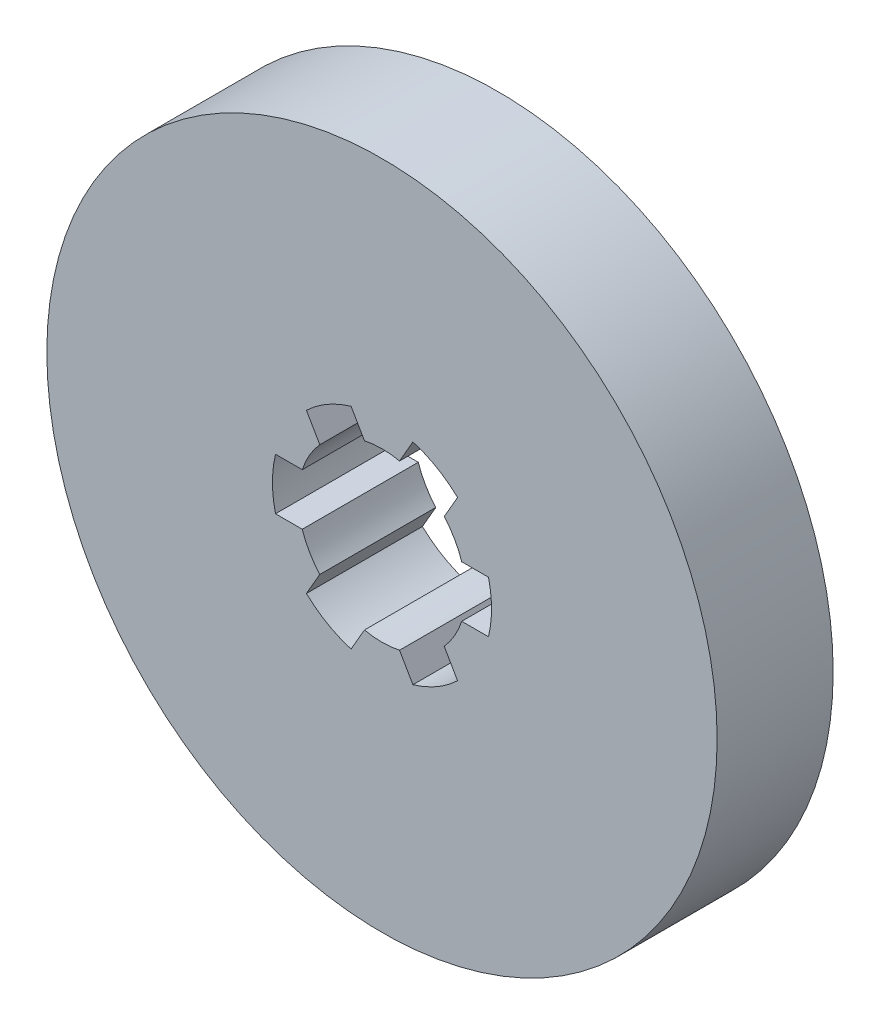
ISO-10303-21;
HEADER;
FILE_DESCRIPTION(('STEP AP214'),'2;1');
FILE_NAME('part.step','',(''),(''),'','','');
FILE_SCHEMA(('AUTOMOTIVE_DESIGN { 1 0 10303 214 1 1 1 1 }'));
ENDSEC;
DATA;
#1=APPLICATION_CONTEXT('core data for automotive mechanical design processes');
#2=APPLICATION_PROTOCOL_DEFINITION('international standard','automotive_design',2000,#1);
#3=PRODUCT_CONTEXT('',#1,'mechanical');
#4=PRODUCT('Part','Part','',(#3));
#5=PRODUCT_RELATED_PRODUCT_CATEGORY('part','',(#4));
#6=PRODUCT_DEFINITION_FORMATION('','',#4);
#7=PRODUCT_DEFINITION_CONTEXT('part definition',#1,'design');
#8=PRODUCT_DEFINITION('design','',#6,#7);
#9=PRODUCT_DEFINITION_SHAPE('','',#8);
#10=(LENGTH_UNIT() NAMED_UNIT(*) SI_UNIT(.MILLI.,.METRE.));
#11=(NAMED_UNIT(*) PLANE_ANGLE_UNIT() SI_UNIT($,.RADIAN.));
#12=(NAMED_UNIT(*) SI_UNIT($,.STERADIAN.) SOLID_ANGLE_UNIT());
#13=UNCERTAINTY_MEASURE_WITH_UNIT(LENGTH_MEASURE(1.E-05),#10,'distance_accuracy_value','');
#14=(GEOMETRIC_REPRESENTATION_CONTEXT(3) GLOBAL_UNCERTAINTY_ASSIGNED_CONTEXT((#13)) GLOBAL_UNIT_ASSIGNED_CONTEXT((#10,
#11,#12)) REPRESENTATION_CONTEXT('',''));
#15=CARTESIAN_POINT('',(0.,0.,0.));
#16=DIRECTION('',(0.,0.,1.));
#17=DIRECTION('',(1.,0.,0.));
#18=AXIS2_PLACEMENT_3D('',#15,#16,#17);
#19=CARTESIAN_POINT('',(0.,0.,9.));
#20=DIRECTION('',(0.,0.,1.));
#21=DIRECTION('',(1.,0.,0.));
#22=AXIS2_PLACEMENT_3D('',#19,#20,#21);
#23=PLANE('',#22);
#24=CARTESIAN_POINT('',(0.,0.,9.));
#25=DIRECTION('',(0.,0.,1.));
#26=DIRECTION('',(1.,0.,0.));
#27=AXIS2_PLACEMENT_3D('',#24,#25,#26);
#28=CIRCLE('',#27,26.);
#29=CARTESIAN_POINT('',(26.,0.,9.));
#30=VERTEX_POINT('',#29);
#31=EDGE_CURVE('E11',#30,#30,#28,.T.);
#32=ORIENTED_EDGE('',*,*,#31,.T.);
#33=EDGE_LOOP('',(#32));
#34=FACE_BOUND('',#33,.T.);
#35=CARTESIAN_POINT('',(1.41538913929051E-05,0.000114129818460512,9.));
#36=DIRECTION('',(0.,0.,1.));
#37=DIRECTION('',(1.,0.,0.));
#38=AXIS2_PLACEMENT_3D('',#35,#36,#37);
#39=CIRCLE('',#38,6.5);
#40=CARTESIAN_POINT('',(1.36029256553576,6.35618545122562,9.));
#41=VERTEX_POINT('',#40);
#42=CARTESIAN_POINT('',(-1.36026425775297,6.35618545122562,9.));
#43=VERTEX_POINT('',#42);
#44=EDGE_CURVE('E424',#41,#43,#39,.T.);
#45=ORIENTED_EDGE('',*,*,#44,.F.);
#46=DIRECTION('',(0.5,0.866025403784439,0.));
#47=VECTOR('',#46,1.);
#48=CARTESIAN_POINT('',(1.87946691116143,7.2554217958356,9.));
#49=LINE('',#48,#47);
#50=CARTESIAN_POINT('',(2.3986412567871,8.15465814044558,9.));
#51=VERTEX_POINT('',#50);
#52=EDGE_CURVE('E234',#41,#51,#49,.T.);
#53=ORIENTED_EDGE('',*,*,#52,.T.);
#54=CARTESIAN_POINT('',(1.4153891405265E-05,0.000114129818509518,9.));
#55=DIRECTION('',(0.,0.,1.));
#56=DIRECTION('',(1.,0.,0.));
#57=AXIS2_PLACEMENT_3D('',#54,#55,#56);
#58=CIRCLE('',#57,8.5);
#59=CARTESIAN_POINT('',(5.86274287192485,6.15465814044558,9.));
#60=VERTEX_POINT('',#59);
#61=EDGE_CURVE('E352',#60,#51,#58,.T.);
#62=ORIENTED_EDGE('',*,*,#61,.F.);
#63=DIRECTION('',(0.5,0.866025403784439,0.));
#64=VECTOR('',#63,1.);
#65=CARTESIAN_POINT('',(5.34356852629918,5.2554217958356,9.));
#66=LINE('',#65,#64);
#67=CARTESIAN_POINT('',(4.82439418067351,4.35618545122562,9.));
#68=VERTEX_POINT('',#67);
#69=EDGE_CURVE('E38',#68,#60,#66,.T.);
#70=ORIENTED_EDGE('',*,*,#69,.F.);
#71=CARTESIAN_POINT('',(1.41538913857493E-05,0.000114129818478944,9.));
#72=DIRECTION('',(0.,0.,1.));
#73=DIRECTION('',(1.,0.,0.));
#74=AXIS2_PLACEMENT_3D('',#71,#72,#73);
#75=CIRCLE('',#74,6.5);
#76=CARTESIAN_POINT('',(6.18467259231788,2.00011412981848,9.));
#77=VERTEX_POINT('',#76);
#78=EDGE_CURVE('E420',#77,#68,#75,.T.);
#79=ORIENTED_EDGE('',*,*,#78,.F.);
#80=DIRECTION('',(1.,0.,0.));
#81=VECTOR('',#80,1.);
#82=CARTESIAN_POINT('',(7.22302128356921,2.00011412981848,9.));
#83=LINE('',#82,#81);
#84=CARTESIAN_POINT('',(8.26136997482055,2.00011412981848,9.));
#85=VERTEX_POINT('',#84);
#86=EDGE_CURVE('E404',#77,#85,#83,.T.);
#87=ORIENTED_EDGE('',*,*,#86,.T.);
#88=CARTESIAN_POINT('',(1.41538913844483E-05,0.000114129818484581,9.));
#89=DIRECTION('',(0.,0.,1.));
#90=DIRECTION('',(1.,0.,0.));
#91=AXIS2_PLACEMENT_3D('',#88,#89,#90);
#92=CIRCLE('',#91,8.5);
#93=CARTESIAN_POINT('',(8.26136997482055,-1.99988587018151,9.));
#94=VERTEX_POINT('',#93);
#95=EDGE_CURVE('E412',#94,#85,#92,.T.);
#96=ORIENTED_EDGE('',*,*,#95,.F.);
#97=DIRECTION('',(1.,0.,0.));
#98=VECTOR('',#97,1.);
#99=CARTESIAN_POINT('',(7.22302128356921,-1.99988587018151,9.));
#100=LINE('',#99,#98);
#101=CARTESIAN_POINT('',(6.18467259231788,-1.99988587018151,9.));
#102=VERTEX_POINT('',#101);
#103=EDGE_CURVE('E408',#102,#94,#100,.T.);
#104=ORIENTED_EDGE('',*,*,#103,.F.);
#105=CARTESIAN_POINT('',(1.41538913853156E-05,0.000114129818493038,9.));
#106=DIRECTION('',(0.,0.,1.));
#107=DIRECTION('',(1.,0.,0.));
#108=AXIS2_PLACEMENT_3D('',#105,#106,#107);
#109=CIRCLE('',#108,6.5);
#110=CARTESIAN_POINT('',(4.82439418067352,-4.35595719158865,9.));
#111=VERTEX_POINT('',#110);
#112=EDGE_CURVE('E416',#111,#102,#109,.T.);
#113=ORIENTED_EDGE('',*,*,#112,.F.);
#114=DIRECTION('',(0.5,-0.866025403784439,0.));
#115=VECTOR('',#114,1.);
#116=CARTESIAN_POINT('',(5.34356852629918,-5.25519353619863,9.));
#117=LINE('',#116,#115);
#118=CARTESIAN_POINT('',(5.86274287192485,-6.15442988080861,9.));
#119=VERTEX_POINT('',#118);
#120=EDGE_CURVE('E400',#111,#119,#117,.T.);
#121=ORIENTED_EDGE('',*,*,#120,.T.);
#122=CARTESIAN_POINT('',(1.41538914030966E-05,0.000114129818468318,9.));
#123=DIRECTION('',(0.,0.,1.));
#124=DIRECTION('',(1.,0.,0.));
#125=AXIS2_PLACEMENT_3D('',#122,#123,#124);
#126=CIRCLE('',#125,8.5);
#127=CARTESIAN_POINT('',(2.39864125678709,-8.15442988080861,9.));
#128=VERTEX_POINT('',#127);
#129=EDGE_CURVE('E396',#128,#119,#126,.T.);
#130=ORIENTED_EDGE('',*,*,#129,.F.);
#131=DIRECTION('',(0.5,-0.866025403784439,0.));
#132=VECTOR('',#131,1.);
#133=CARTESIAN_POINT('',(1.87946691116143,-7.25519353619863,9.));
#134=LINE('',#133,#132);
#135=CARTESIAN_POINT('',(1.36029256553576,-6.35595719158865,9.));
#136=VERTEX_POINT('',#135);
#137=EDGE_CURVE('E392',#136,#128,#134,.T.);
#138=ORIENTED_EDGE('',*,*,#137,.F.);
#139=CARTESIAN_POINT('',(1.41538913914956E-05,0.000114129818493038,9.));
#140=DIRECTION('',(0.,0.,1.));
#141=DIRECTION('',(1.,0.,0.));
#142=AXIS2_PLACEMENT_3D('',#139,#140,#141);
#143=CIRCLE('',#142,6.5);
#144=CARTESIAN_POINT('',(-1.36026425775298,-6.35595719158865,9.));
#145=VERTEX_POINT('',#144);
#146=EDGE_CURVE('E258',#145,#136,#143,.T.);
#147=ORIENTED_EDGE('',*,*,#146,.F.);
#148=DIRECTION('',(-0.5,-0.866025403784439,0.));
#149=VECTOR('',#148,1.);
#150=CARTESIAN_POINT('',(-1.87943860337864,-7.25519353619863,9.));
#151=LINE('',#150,#149);
#152=CARTESIAN_POINT('',(-2.39861294900431,-8.15442988080861,9.));
#153=VERTEX_POINT('',#152);
#154=EDGE_CURVE('E380',#145,#153,#151,.T.);
#155=ORIENTED_EDGE('',*,*,#154,.T.);
#156=CARTESIAN_POINT('',(1.41538913814125E-05,0.000114129818462247,9.));
#157=DIRECTION('',(0.,0.,1.));
#158=DIRECTION('',(1.,0.,0.));
#159=AXIS2_PLACEMENT_3D('',#156,#157,#158);
#160=CIRCLE('',#159,8.5);
#161=CARTESIAN_POINT('',(-5.86271456414206,-6.15442988080861,9.));
#162=VERTEX_POINT('',#161);
#163=EDGE_CURVE('E388',#162,#153,#160,.T.);
#164=ORIENTED_EDGE('',*,*,#163,.F.);
#165=DIRECTION('',(-0.5,-0.866025403784439,0.));
#166=VECTOR('',#165,1.);
#167=CARTESIAN_POINT('',(-5.3435402185164,-5.25519353619863,9.));
#168=LINE('',#167,#166);
#169=CARTESIAN_POINT('',(-4.82436587289073,-4.35595719158865,9.));
#170=VERTEX_POINT('',#169);
#171=EDGE_CURVE('E384',#170,#162,#168,.T.);
#172=ORIENTED_EDGE('',*,*,#171,.F.);
#173=CARTESIAN_POINT('',(1.41538913610295E-05,0.000114129818467017,9.));
#174=DIRECTION('',(0.,0.,1.));
#175=DIRECTION('',(1.,0.,0.));
#176=AXIS2_PLACEMENT_3D('',#173,#174,#175);
#177=CIRCLE('',#176,6.5);
#178=CARTESIAN_POINT('',(-6.1846442845351,-1.99988587018151,9.));
#179=VERTEX_POINT('',#178);
#180=EDGE_CURVE('E267',#179,#170,#177,.T.);
#181=ORIENTED_EDGE('',*,*,#180,.F.);
#182=DIRECTION('',(-1.,0.,0.));
#183=VECTOR('',#182,1.);
#184=CARTESIAN_POINT('',(-7.22299297578643,-1.99988587018151,9.));
#185=LINE('',#184,#183);
#186=CARTESIAN_POINT('',(-8.26134166703776,-1.99988587018151,9.));
#187=VERTEX_POINT('',#186);
#188=EDGE_CURVE('E376',#179,#187,#185,.T.);
#189=ORIENTED_EDGE('',*,*,#188,.T.);
#190=CARTESIAN_POINT('',(1.41538913714378E-05,0.000114129818484148,9.));
#191=DIRECTION('',(0.,0.,1.));
#192=DIRECTION('',(1.,0.,0.));
#193=AXIS2_PLACEMENT_3D('',#190,#191,#192);
#194=CIRCLE('',#193,8.5);
#195=CARTESIAN_POINT('',(-8.26134166703776,2.00011412981848,9.));
#196=VERTEX_POINT('',#195);
#197=EDGE_CURVE('E372',#196,#187,#194,.T.);
#198=ORIENTED_EDGE('',*,*,#197,.F.);
#199=DIRECTION('',(-1.,0.,0.));
#200=VECTOR('',#199,1.);
#201=CARTESIAN_POINT('',(-7.22299297578643,2.00011412981848,9.));
#202=LINE('',#201,#200);
#203=CARTESIAN_POINT('',(-6.1846442845351,2.00011412981848,9.));
#204=VERTEX_POINT('',#203);
#205=EDGE_CURVE('E368',#204,#196,#202,.T.);
#206=ORIENTED_EDGE('',*,*,#205,.F.);
#207=CARTESIAN_POINT('',(1.4153891375341E-05,0.000114129818493255,9.));
#208=DIRECTION('',(0.,0.,1.));
#209=DIRECTION('',(1.,0.,0.));
#210=AXIS2_PLACEMENT_3D('',#207,#208,#209);
#211=CIRCLE('',#210,6.5);
#212=CARTESIAN_POINT('',(-4.82436587289073,4.35618545122562,9.));
#213=VERTEX_POINT('',#212);
#214=EDGE_CURVE('E427',#213,#204,#211,.T.);
#215=ORIENTED_EDGE('',*,*,#214,.F.);
#216=DIRECTION('',(-0.5,0.866025403784439,0.));
#217=VECTOR('',#216,1.);
#218=CARTESIAN_POINT('',(-5.3435402185164,5.2554217958356,9.));
#219=LINE('',#218,#217);
#220=CARTESIAN_POINT('',(-5.86271456414206,6.15465814044558,9.));
#221=VERTEX_POINT('',#220);
#222=EDGE_CURVE('E356',#213,#221,#219,.T.);
#223=ORIENTED_EDGE('',*,*,#222,.T.);
#224=CARTESIAN_POINT('',(1.41538913857493E-05,0.00011412981849564,9.));
#225=DIRECTION('',(0.,0.,1.));
#226=DIRECTION('',(1.,0.,0.));
#227=AXIS2_PLACEMENT_3D('',#224,#225,#226);
#228=CIRCLE('',#227,8.5);
#229=CARTESIAN_POINT('',(-2.39861294900431,8.15465814044558,9.));
#230=VERTEX_POINT('',#229);
#231=EDGE_CURVE('E364',#230,#221,#228,.T.);
#232=ORIENTED_EDGE('',*,*,#231,.F.);
#233=DIRECTION('',(-0.5,0.866025403784439,0.));
#234=VECTOR('',#233,1.);
#235=CARTESIAN_POINT('',(-1.87943860337864,7.2554217958356,9.));
#236=LINE('',#235,#234);
#237=EDGE_CURVE('E360',#43,#230,#236,.T.);
#238=ORIENTED_EDGE('',*,*,#237,.F.);
#239=EDGE_LOOP('',(#45,#53,#62,#70,#79,#87,#96,#104,#113,#121,#130,#138,#147,#155,#164,#172,
#181,#189,#198,#206,#215,#223,#232,#238));
#240=FACE_BOUND('',#239,.T.);
#241=ADVANCED_FACE('F17',(#34,#240),#23,.T.);
#242=CARTESIAN_POINT('',(0.,0.,0.));
#243=DIRECTION('',(0.,0.,1.));
#244=DIRECTION('',(1.,0.,0.));
#245=AXIS2_PLACEMENT_3D('',#242,#243,#244);
#246=PLANE('',#245);
#247=CARTESIAN_POINT('',(0.,0.,0.));
#248=DIRECTION('',(0.,0.,1.));
#249=DIRECTION('',(1.,0.,0.));
#250=AXIS2_PLACEMENT_3D('',#247,#248,#249);
#251=CIRCLE('',#250,26.);
#252=CARTESIAN_POINT('',(26.,0.,0.));
#253=VERTEX_POINT('',#252);
#254=EDGE_CURVE('E21',#253,#253,#251,.T.);
#255=ORIENTED_EDGE('',*,*,#254,.F.);
#256=EDGE_LOOP('',(#255));
#257=FACE_BOUND('',#256,.T.);
#258=DIRECTION('',(0.5,0.866025403784439,0.));
#259=VECTOR('',#258,1.);
#260=CARTESIAN_POINT('',(1.87946691116143,7.2554217958356,0.));
#261=LINE('',#260,#259);
#262=CARTESIAN_POINT('',(1.36029256553576,6.35618545122562,0.));
#263=VERTEX_POINT('',#262);
#264=CARTESIAN_POINT('',(2.3986412567871,8.15465814044558,0.));
#265=VERTEX_POINT('',#264);
#266=EDGE_CURVE('E50',#263,#265,#261,.T.);
#267=ORIENTED_EDGE('',*,*,#266,.F.);
#268=CARTESIAN_POINT('',(1.41538913929051E-05,0.000114129818460512,0.));
#269=DIRECTION('',(0.,0.,1.));
#270=DIRECTION('',(1.,0.,0.));
#271=AXIS2_PLACEMENT_3D('',#268,#269,#270);
#272=CIRCLE('',#271,6.5);
#273=CARTESIAN_POINT('',(-1.36026425775297,6.35618545122562,0.));
#274=VERTEX_POINT('',#273);
#275=EDGE_CURVE('E242',#263,#274,#272,.T.);
#276=ORIENTED_EDGE('',*,*,#275,.T.);
#277=DIRECTION('',(-0.5,0.866025403784439,0.));
#278=VECTOR('',#277,1.);
#279=CARTESIAN_POINT('',(-1.87943860337864,7.2554217958356,0.));
#280=LINE('',#279,#278);
#281=CARTESIAN_POINT('',(-2.39861294900431,8.15465814044558,0.));
#282=VERTEX_POINT('',#281);
#283=EDGE_CURVE('E276',#274,#282,#280,.T.);
#284=ORIENTED_EDGE('',*,*,#283,.T.);
#285=CARTESIAN_POINT('',(1.41538913857493E-05,0.00011412981849564,0.));
#286=DIRECTION('',(0.,0.,1.));
#287=DIRECTION('',(1.,0.,0.));
#288=AXIS2_PLACEMENT_3D('',#285,#286,#287);
#289=CIRCLE('',#288,8.5);
#290=CARTESIAN_POINT('',(-5.86271456414206,6.15465814044558,0.));
#291=VERTEX_POINT('',#290);
#292=EDGE_CURVE('E279',#282,#291,#289,.T.);
#293=ORIENTED_EDGE('',*,*,#292,.T.);
#294=DIRECTION('',(-0.5,0.866025403784439,0.));
#295=VECTOR('',#294,1.);
#296=CARTESIAN_POINT('',(-5.3435402185164,5.2554217958356,0.));
#297=LINE('',#296,#295);
#298=CARTESIAN_POINT('',(-4.82436587289073,4.35618545122562,0.));
#299=VERTEX_POINT('',#298);
#300=EDGE_CURVE('E272',#299,#291,#297,.T.);
#301=ORIENTED_EDGE('',*,*,#300,.F.);
#302=CARTESIAN_POINT('',(1.4153891375341E-05,0.000114129818493255,0.));
#303=DIRECTION('',(0.,0.,1.));
#304=DIRECTION('',(1.,0.,0.));
#305=AXIS2_PLACEMENT_3D('',#302,#303,#304);
#306=CIRCLE('',#305,6.5);
#307=CARTESIAN_POINT('',(-6.1846442845351,2.00011412981848,0.));
#308=VERTEX_POINT('',#307);
#309=EDGE_CURVE('E248',#299,#308,#306,.T.);
#310=ORIENTED_EDGE('',*,*,#309,.T.);
#311=DIRECTION('',(-1.,0.,0.));
#312=VECTOR('',#311,1.);
#313=CARTESIAN_POINT('',(-7.22299297578643,2.00011412981848,0.));
#314=LINE('',#313,#312);
#315=CARTESIAN_POINT('',(-8.26134166703776,2.00011412981848,0.));
#316=VERTEX_POINT('',#315);
#317=EDGE_CURVE('E283',#308,#316,#314,.T.);
#318=ORIENTED_EDGE('',*,*,#317,.T.);
#319=CARTESIAN_POINT('',(1.41538913714378E-05,0.000114129818484148,0.));
#320=DIRECTION('',(0.,0.,1.));
#321=DIRECTION('',(1.,0.,0.));
#322=AXIS2_PLACEMENT_3D('',#319,#320,#321);
#323=CIRCLE('',#322,8.5);
#324=CARTESIAN_POINT('',(-8.26134166703776,-1.99988587018151,0.));
#325=VERTEX_POINT('',#324);
#326=EDGE_CURVE('E287',#316,#325,#323,.T.);
#327=ORIENTED_EDGE('',*,*,#326,.T.);
#328=DIRECTION('',(-1.,0.,0.));
#329=VECTOR('',#328,1.);
#330=CARTESIAN_POINT('',(-7.22299297578643,-1.99988587018151,0.));
#331=LINE('',#330,#329);
#332=CARTESIAN_POINT('',(-6.1846442845351,-1.99988587018151,0.));
#333=VERTEX_POINT('',#332);
#334=EDGE_CURVE('E291',#333,#325,#331,.T.);
#335=ORIENTED_EDGE('',*,*,#334,.F.);
#336=CARTESIAN_POINT('',(1.41538913610295E-05,0.000114129818467017,0.));
#337=DIRECTION('',(0.,0.,1.));
#338=DIRECTION('',(1.,0.,0.));
#339=AXIS2_PLACEMENT_3D('',#336,#337,#338);
#340=CIRCLE('',#339,6.5);
#341=CARTESIAN_POINT('',(-4.82436587289073,-4.35595719158865,0.));
#342=VERTEX_POINT('',#341);
#343=EDGE_CURVE('E341',#333,#342,#340,.T.);
#344=ORIENTED_EDGE('',*,*,#343,.T.);
#345=DIRECTION('',(-0.5,-0.866025403784439,0.));
#346=VECTOR('',#345,1.);
#347=CARTESIAN_POINT('',(-5.3435402185164,-5.25519353619863,0.));
#348=LINE('',#347,#346);
#349=CARTESIAN_POINT('',(-5.86271456414206,-6.15442988080861,0.));
#350=VERTEX_POINT('',#349);
#351=EDGE_CURVE('E299',#342,#350,#348,.T.);
#352=ORIENTED_EDGE('',*,*,#351,.T.);
#353=CARTESIAN_POINT('',(1.41538913814125E-05,0.000114129818462247,0.));
#354=DIRECTION('',(0.,0.,1.));
#355=DIRECTION('',(1.,0.,0.));
#356=AXIS2_PLACEMENT_3D('',#353,#354,#355);
#357=CIRCLE('',#356,8.5);
#358=CARTESIAN_POINT('',(-2.39861294900431,-8.15442988080861,0.));
#359=VERTEX_POINT('',#358);
#360=EDGE_CURVE('E303',#350,#359,#357,.T.);
#361=ORIENTED_EDGE('',*,*,#360,.T.);
#362=DIRECTION('',(-0.5,-0.866025403784439,0.));
#363=VECTOR('',#362,1.);
#364=CARTESIAN_POINT('',(-1.87943860337864,-7.25519353619863,0.));
#365=LINE('',#364,#363);
#366=CARTESIAN_POINT('',(-1.36026425775298,-6.35595719158865,0.));
#367=VERTEX_POINT('',#366);
#368=EDGE_CURVE('E295',#367,#359,#365,.T.);
#369=ORIENTED_EDGE('',*,*,#368,.F.);
#370=CARTESIAN_POINT('',(1.41538913914956E-05,0.000114129818493038,0.));
#371=DIRECTION('',(0.,0.,1.));
#372=DIRECTION('',(1.,0.,0.));
#373=AXIS2_PLACEMENT_3D('',#370,#371,#372);
#374=CIRCLE('',#373,6.5);
#375=CARTESIAN_POINT('',(1.36029256553576,-6.35595719158865,0.));
#376=VERTEX_POINT('',#375);
#377=EDGE_CURVE('E345',#367,#376,#374,.T.);
#378=ORIENTED_EDGE('',*,*,#377,.T.);
#379=DIRECTION('',(0.5,-0.866025403784439,0.));
#380=VECTOR('',#379,1.);
#381=CARTESIAN_POINT('',(1.87946691116143,-7.25519353619863,0.));
#382=LINE('',#381,#380);
#383=CARTESIAN_POINT('',(2.39864125678709,-8.15442988080861,0.));
#384=VERTEX_POINT('',#383);
#385=EDGE_CURVE('E307',#376,#384,#382,.T.);
#386=ORIENTED_EDGE('',*,*,#385,.T.);
#387=CARTESIAN_POINT('',(1.41538914030966E-05,0.000114129818468318,0.));
#388=DIRECTION('',(0.,0.,1.));
#389=DIRECTION('',(1.,0.,0.));
#390=AXIS2_PLACEMENT_3D('',#387,#388,#389);
#391=CIRCLE('',#390,8.5);
#392=CARTESIAN_POINT('',(5.86274287192485,-6.15442988080861,0.));
#393=VERTEX_POINT('',#392);
#394=EDGE_CURVE('E311',#384,#393,#391,.T.);
#395=ORIENTED_EDGE('',*,*,#394,.T.);
#396=DIRECTION('',(0.5,-0.866025403784439,0.));
#397=VECTOR('',#396,1.);
#398=CARTESIAN_POINT('',(5.34356852629918,-5.25519353619863,0.));
#399=LINE('',#398,#397);
#400=CARTESIAN_POINT('',(4.82439418067352,-4.35595719158865,0.));
#401=VERTEX_POINT('',#400);
#402=EDGE_CURVE('E315',#401,#393,#399,.T.);
#403=ORIENTED_EDGE('',*,*,#402,.F.);
#404=CARTESIAN_POINT('',(1.41538913853156E-05,0.000114129818493038,0.));
#405=DIRECTION('',(0.,0.,1.));
#406=DIRECTION('',(1.,0.,0.));
#407=AXIS2_PLACEMENT_3D('',#404,#405,#406);
#408=CIRCLE('',#407,6.5);
#409=CARTESIAN_POINT('',(6.18467259231788,-1.99988587018151,0.));
#410=VERTEX_POINT('',#409);
#411=EDGE_CURVE('E331',#401,#410,#408,.T.);
#412=ORIENTED_EDGE('',*,*,#411,.T.);
#413=DIRECTION('',(1.,0.,0.));
#414=VECTOR('',#413,1.);
#415=CARTESIAN_POINT('',(7.22302128356921,-1.99988587018151,0.));
#416=LINE('',#415,#414);
#417=CARTESIAN_POINT('',(8.26136997482055,-1.99988587018151,0.));
#418=VERTEX_POINT('',#417);
#419=EDGE_CURVE('E323',#410,#418,#416,.T.);
#420=ORIENTED_EDGE('',*,*,#419,.T.);
#421=CARTESIAN_POINT('',(1.41538913844483E-05,0.000114129818484581,0.));
#422=DIRECTION('',(0.,0.,1.));
#423=DIRECTION('',(1.,0.,0.));
#424=AXIS2_PLACEMENT_3D('',#421,#422,#423);
#425=CIRCLE('',#424,8.5);
#426=CARTESIAN_POINT('',(8.26136997482055,2.00011412981848,0.));
#427=VERTEX_POINT('',#426);
#428=EDGE_CURVE('E327',#418,#427,#425,.T.);
#429=ORIENTED_EDGE('',*,*,#428,.T.);
#430=DIRECTION('',(1.,0.,0.));
#431=VECTOR('',#430,1.);
#432=CARTESIAN_POINT('',(7.22302128356921,2.00011412981848,0.));
#433=LINE('',#432,#431);
#434=CARTESIAN_POINT('',(6.18467259231788,2.00011412981848,0.));
#435=VERTEX_POINT('',#434);
#436=EDGE_CURVE('E319',#435,#427,#433,.T.);
#437=ORIENTED_EDGE('',*,*,#436,.F.);
#438=CARTESIAN_POINT('',(1.41538913857493E-05,0.000114129818478944,0.));
#439=DIRECTION('',(0.,0.,1.));
#440=DIRECTION('',(1.,0.,0.));
#441=AXIS2_PLACEMENT_3D('',#438,#439,#440);
#442=CIRCLE('',#441,6.5);
#443=CARTESIAN_POINT('',(4.82439418067351,4.35618545122562,0.));
#444=VERTEX_POINT('',#443);
#445=EDGE_CURVE('E249',#435,#444,#442,.T.);
#446=ORIENTED_EDGE('',*,*,#445,.T.);
#447=DIRECTION('',(0.5,0.866025403784439,0.));
#448=VECTOR('',#447,1.);
#449=CARTESIAN_POINT('',(5.34356852629918,5.2554217958356,0.));
#450=LINE('',#449,#448);
#451=CARTESIAN_POINT('',(5.86274287192485,6.15465814044558,0.));
#452=VERTEX_POINT('',#451);
#453=EDGE_CURVE('E257',#444,#452,#450,.T.);
#454=ORIENTED_EDGE('',*,*,#453,.T.);
#455=CARTESIAN_POINT('',(1.4153891405265E-05,0.000114129818509518,0.));
#456=DIRECTION('',(0.,0.,1.));
#457=DIRECTION('',(1.,0.,0.));
#458=AXIS2_PLACEMENT_3D('',#455,#456,#457);
#459=CIRCLE('',#458,8.5);
#460=EDGE_CURVE('E255',#452,#265,#459,.T.);
#461=ORIENTED_EDGE('',*,*,#460,.T.);
#462=EDGE_LOOP('',(#267,#276,#284,#293,#301,#310,#318,#327,#335,#344,#352,#361,#369,#378,#386,
#395,#403,#412,#420,#429,#437,#446,#454,#461));
#463=FACE_BOUND('',#462,.T.);
#464=ADVANCED_FACE('F252',(#257,#463),#246,.F.);
#465=CARTESIAN_POINT('',(0.,0.,9.));
#466=DIRECTION('',(0.,0.,-1.));
#467=DIRECTION('',(-1.,0.,0.));
#468=AXIS2_PLACEMENT_3D('',#465,#466,#467);
#469=CYLINDRICAL_SURFACE('',#468,26.);
#470=ORIENTED_EDGE('',*,*,#31,.F.);
#471=EDGE_LOOP('',(#470));
#472=FACE_BOUND('',#471,.T.);
#473=ORIENTED_EDGE('',*,*,#254,.T.);
#474=EDGE_LOOP('',(#473));
#475=FACE_BOUND('',#474,.T.);
#476=ADVANCED_FACE('F19',(#472,#475),#469,.T.);
#477=CARTESIAN_POINT('',(1.87946691116143,7.2554217958356,0.));
#478=DIRECTION('',(0.866025403784439,-0.5,0.));
#479=DIRECTION('',(0.5,0.866025403784439,0.));
#480=AXIS2_PLACEMENT_3D('',#477,#478,#479);
#481=PLANE('',#480);
#482=ORIENTED_EDGE('',*,*,#52,.F.);
#483=DIRECTION('',(0.,0.,1.));
#484=VECTOR('',#483,1.);
#485=CARTESIAN_POINT('',(1.36029256553576,6.35618545122562,0.));
#486=LINE('',#485,#484);
#487=EDGE_CURVE('E230',#263,#41,#486,.T.);
#488=ORIENTED_EDGE('',*,*,#487,.F.);
#489=ORIENTED_EDGE('',*,*,#266,.T.);
#490=DIRECTION('',(0.,0.,1.));
#491=VECTOR('',#490,1.);
#492=CARTESIAN_POINT('',(2.3986412567871,8.15465814044558,0.));
#493=LINE('',#492,#491);
#494=EDGE_CURVE('E349',#265,#51,#493,.T.);
#495=ORIENTED_EDGE('',*,*,#494,.T.);
#496=EDGE_LOOP('',(#482,#488,#489,#495));
#497=FACE_BOUND('',#496,.T.);
#498=ADVANCED_FACE('F232',(#497),#481,.T.);
#499=CARTESIAN_POINT('',(1.41538913929051E-05,0.000114129818460512,0.));
#500=DIRECTION('',(0.,0.,1.));
#501=DIRECTION('',(1.,0.,0.));
#502=AXIS2_PLACEMENT_3D('',#499,#500,#501);
#503=CYLINDRICAL_SURFACE('',#502,6.5);
#504=ORIENTED_EDGE('',*,*,#44,.T.);
#505=DIRECTION('',(0.,0.,1.));
#506=VECTOR('',#505,1.);
#507=CARTESIAN_POINT('',(-1.36026425775297,6.35618545122562,0.));
#508=LINE('',#507,#506);
#509=EDGE_CURVE('E239',#274,#43,#508,.T.);
#510=ORIENTED_EDGE('',*,*,#509,.F.);
#511=ORIENTED_EDGE('',*,*,#275,.F.);
#512=ORIENTED_EDGE('',*,*,#487,.T.);
#513=EDGE_LOOP('',(#504,#510,#511,#512));
#514=FACE_BOUND('',#513,.T.);
#515=ADVANCED_FACE('F243',(#514),#503,.F.);
#516=CARTESIAN_POINT('',(-1.87943860337864,7.2554217958356,0.));
#517=DIRECTION('',(0.866025403784439,0.5,0.));
#518=DIRECTION('',(-0.5,0.866025403784439,0.));
#519=AXIS2_PLACEMENT_3D('',#516,#517,#518);
#520=PLANE('',#519);
#521=ORIENTED_EDGE('',*,*,#237,.T.);
#522=DIRECTION('',(0.,0.,1.));
#523=VECTOR('',#522,1.);
#524=CARTESIAN_POINT('',(-2.39861294900431,8.15465814044558,0.));
#525=LINE('',#524,#523);
#526=EDGE_CURVE('E487',#282,#230,#525,.T.);
#527=ORIENTED_EDGE('',*,*,#526,.F.);
#528=ORIENTED_EDGE('',*,*,#283,.F.);
#529=ORIENTED_EDGE('',*,*,#509,.T.);
#530=EDGE_LOOP('',(#521,#527,#528,#529));
#531=FACE_BOUND('',#530,.T.);
#532=ADVANCED_FACE('F585',(#531),#520,.F.);
#533=CARTESIAN_POINT('',(1.41538913857493E-05,0.00011412981849564,0.));
#534=DIRECTION('',(0.,0.,1.));
#535=DIRECTION('',(1.,0.,0.));
#536=AXIS2_PLACEMENT_3D('',#533,#534,#535);
#537=CYLINDRICAL_SURFACE('',#536,8.5);
#538=ORIENTED_EDGE('',*,*,#231,.T.);
#539=DIRECTION('',(0.,0.,1.));
#540=VECTOR('',#539,1.);
#541=CARTESIAN_POINT('',(-5.86271456414206,6.15465814044558,0.));
#542=LINE('',#541,#540);
#543=EDGE_CURVE('E484',#291,#221,#542,.T.);
#544=ORIENTED_EDGE('',*,*,#543,.F.);
#545=ORIENTED_EDGE('',*,*,#292,.F.);
#546=ORIENTED_EDGE('',*,*,#526,.T.);
#547=EDGE_LOOP('',(#538,#544,#545,#546));
#548=FACE_BOUND('',#547,.T.);
#549=ADVANCED_FACE('F583',(#548),#537,.F.);
#550=CARTESIAN_POINT('',(-5.3435402185164,5.2554217958356,0.));
#551=DIRECTION('',(0.866025403784439,0.5,0.));
#552=DIRECTION('',(-0.5,0.866025403784439,0.));
#553=AXIS2_PLACEMENT_3D('',#550,#551,#552);
#554=PLANE('',#553);
#555=ORIENTED_EDGE('',*,*,#222,.F.);
#556=DIRECTION('',(0.,0.,1.));
#557=VECTOR('',#556,1.);
#558=CARTESIAN_POINT('',(-4.82436587289073,4.35618545122562,0.));
#559=LINE('',#558,#557);
#560=EDGE_CURVE('E483',#299,#213,#559,.T.);
#561=ORIENTED_EDGE('',*,*,#560,.F.);
#562=ORIENTED_EDGE('',*,*,#300,.T.);
#563=ORIENTED_EDGE('',*,*,#543,.T.);
#564=EDGE_LOOP('',(#555,#561,#562,#563));
#565=FACE_BOUND('',#564,.T.);
#566=ADVANCED_FACE('F579',(#565),#554,.T.);
#567=CARTESIAN_POINT('',(1.4153891375341E-05,0.000114129818493255,0.));
#568=DIRECTION('',(0.,0.,1.));
#569=DIRECTION('',(1.,0.,0.));
#570=AXIS2_PLACEMENT_3D('',#567,#568,#569);
#571=CYLINDRICAL_SURFACE('',#570,6.5);
#572=ORIENTED_EDGE('',*,*,#214,.T.);
#573=DIRECTION('',(0.,0.,1.));
#574=VECTOR('',#573,1.);
#575=CARTESIAN_POINT('',(-6.1846442845351,2.00011412981848,0.));
#576=LINE('',#575,#574);
#577=EDGE_CURVE('E480',#308,#204,#576,.T.);
#578=ORIENTED_EDGE('',*,*,#577,.F.);
#579=ORIENTED_EDGE('',*,*,#309,.F.);
#580=ORIENTED_EDGE('',*,*,#560,.T.);
#581=EDGE_LOOP('',(#572,#578,#579,#580));
#582=FACE_BOUND('',#581,.T.);
#583=ADVANCED_FACE('F574',(#582),#571,.F.);
#584=CARTESIAN_POINT('',(-7.22299297578643,2.00011412981848,0.));
#585=DIRECTION('',(0.,1.,0.));
#586=DIRECTION('',(0.,0.,1.));
#587=AXIS2_PLACEMENT_3D('',#584,#585,#586);
#588=PLANE('',#587);
#589=ORIENTED_EDGE('',*,*,#205,.T.);
#590=DIRECTION('',(0.,0.,1.));
#591=VECTOR('',#590,1.);
#592=CARTESIAN_POINT('',(-8.26134166703776,2.00011412981848,0.));
#593=LINE('',#592,#591);
#594=EDGE_CURVE('E477',#316,#196,#593,.T.);
#595=ORIENTED_EDGE('',*,*,#594,.F.);
#596=ORIENTED_EDGE('',*,*,#317,.F.);
#597=ORIENTED_EDGE('',*,*,#577,.T.);
#598=EDGE_LOOP('',(#589,#595,#596,#597));
#599=FACE_BOUND('',#598,.T.);
#600=ADVANCED_FACE('F571',(#599),#588,.F.);
#601=CARTESIAN_POINT('',(1.41538913714378E-05,0.000114129818484148,0.));
#602=DIRECTION('',(0.,0.,1.));
#603=DIRECTION('',(1.,0.,0.));
#604=AXIS2_PLACEMENT_3D('',#601,#602,#603);
#605=CYLINDRICAL_SURFACE('',#604,8.5);
#606=ORIENTED_EDGE('',*,*,#197,.T.);
#607=DIRECTION('',(0.,0.,1.));
#608=VECTOR('',#607,1.);
#609=CARTESIAN_POINT('',(-8.26134166703776,-1.99988587018151,0.));
#610=LINE('',#609,#608);
#611=EDGE_CURVE('E474',#325,#187,#610,.T.);
#612=ORIENTED_EDGE('',*,*,#611,.F.);
#613=ORIENTED_EDGE('',*,*,#326,.F.);
#614=ORIENTED_EDGE('',*,*,#594,.T.);
#615=EDGE_LOOP('',(#606,#612,#613,#614));
#616=FACE_BOUND('',#615,.T.);
#617=ADVANCED_FACE('F567',(#616),#605,.F.);
#618=CARTESIAN_POINT('',(-7.22299297578643,-1.99988587018151,0.));
#619=DIRECTION('',(0.,1.,0.));
#620=DIRECTION('',(0.,0.,1.));
#621=AXIS2_PLACEMENT_3D('',#618,#619,#620);
#622=PLANE('',#621);
#623=ORIENTED_EDGE('',*,*,#188,.F.);
#624=DIRECTION('',(0.,0.,1.));
#625=VECTOR('',#624,1.);
#626=CARTESIAN_POINT('',(-6.1846442845351,-1.99988587018151,0.));
#627=LINE('',#626,#625);
#628=EDGE_CURVE('E469',#333,#179,#627,.T.);
#629=ORIENTED_EDGE('',*,*,#628,.F.);
#630=ORIENTED_EDGE('',*,*,#334,.T.);
#631=ORIENTED_EDGE('',*,*,#611,.T.);
#632=EDGE_LOOP('',(#623,#629,#630,#631));
#633=FACE_BOUND('',#632,.T.);
#634=ADVANCED_FACE('F562',(#633),#622,.T.);
#635=CARTESIAN_POINT('',(1.41538913610295E-05,0.000114129818467017,0.));
#636=DIRECTION('',(0.,0.,1.));
#637=DIRECTION('',(1.,0.,0.));
#638=AXIS2_PLACEMENT_3D('',#635,#636,#637);
#639=CYLINDRICAL_SURFACE('',#638,6.5);
#640=ORIENTED_EDGE('',*,*,#180,.T.);
#641=DIRECTION('',(0.,0.,1.));
#642=VECTOR('',#641,1.);
#643=CARTESIAN_POINT('',(-4.82436587289073,-4.35595719158865,0.));
#644=LINE('',#643,#642);
#645=EDGE_CURVE('E466',#342,#170,#644,.T.);
#646=ORIENTED_EDGE('',*,*,#645,.F.);
#647=ORIENTED_EDGE('',*,*,#343,.F.);
#648=ORIENTED_EDGE('',*,*,#628,.T.);
#649=EDGE_LOOP('',(#640,#646,#647,#648));
#650=FACE_BOUND('',#649,.T.);
#651=ADVANCED_FACE('F558',(#650),#639,.F.);
#652=CARTESIAN_POINT('',(-5.3435402185164,-5.25519353619863,0.));
#653=DIRECTION('',(-0.866025403784438,0.5,0.));
#654=DIRECTION('',(-0.5,-0.866025403784439,0.));
#655=AXIS2_PLACEMENT_3D('',#652,#653,#654);
#656=PLANE('',#655);
#657=ORIENTED_EDGE('',*,*,#171,.T.);
#658=DIRECTION('',(0.,0.,1.));
#659=VECTOR('',#658,1.);
#660=CARTESIAN_POINT('',(-5.86271456414206,-6.15442988080861,0.));
#661=LINE('',#660,#659);
#662=EDGE_CURVE('E463',#350,#162,#661,.T.);
#663=ORIENTED_EDGE('',*,*,#662,.F.);
#664=ORIENTED_EDGE('',*,*,#351,.F.);
#665=ORIENTED_EDGE('',*,*,#645,.T.);
#666=EDGE_LOOP('',(#657,#663,#664,#665));
#667=FACE_BOUND('',#666,.T.);
#668=ADVANCED_FACE('F554',(#667),#656,.F.);
#669=CARTESIAN_POINT('',(1.41538913814125E-05,0.000114129818462247,0.));
#670=DIRECTION('',(0.,0.,1.));
#671=DIRECTION('',(1.,0.,0.));
#672=AXIS2_PLACEMENT_3D('',#669,#670,#671);
#673=CYLINDRICAL_SURFACE('',#672,8.5);
#674=ORIENTED_EDGE('',*,*,#163,.T.);
#675=DIRECTION('',(0.,0.,1.));
#676=VECTOR('',#675,1.);
#677=CARTESIAN_POINT('',(-2.39861294900431,-8.15442988080861,0.));
#678=LINE('',#677,#676);
#679=EDGE_CURVE('E460',#359,#153,#678,.T.);
#680=ORIENTED_EDGE('',*,*,#679,.F.);
#681=ORIENTED_EDGE('',*,*,#360,.F.);
#682=ORIENTED_EDGE('',*,*,#662,.T.);
#683=EDGE_LOOP('',(#674,#680,#681,#682));
#684=FACE_BOUND('',#683,.T.);
#685=ADVANCED_FACE('F550',(#684),#673,.F.);
#686=CARTESIAN_POINT('',(-1.87943860337864,-7.25519353619863,0.));
#687=DIRECTION('',(-0.866025403784438,0.5,0.));
#688=DIRECTION('',(-0.5,-0.866025403784439,0.));
#689=AXIS2_PLACEMENT_3D('',#686,#687,#688);
#690=PLANE('',#689);
#691=ORIENTED_EDGE('',*,*,#154,.F.);
#692=DIRECTION('',(0.,0.,1.));
#693=VECTOR('',#692,1.);
#694=CARTESIAN_POINT('',(-1.36026425775298,-6.35595719158865,0.));
#695=LINE('',#694,#693);
#696=EDGE_CURVE('E459',#367,#145,#695,.T.);
#697=ORIENTED_EDGE('',*,*,#696,.F.);
#698=ORIENTED_EDGE('',*,*,#368,.T.);
#699=ORIENTED_EDGE('',*,*,#679,.T.);
#700=EDGE_LOOP('',(#691,#697,#698,#699));
#701=FACE_BOUND('',#700,.T.);
#702=ADVANCED_FACE('F547',(#701),#690,.T.);
#703=CARTESIAN_POINT('',(1.41538913914956E-05,0.000114129818493038,0.));
#704=DIRECTION('',(0.,0.,1.));
#705=DIRECTION('',(1.,0.,0.));
#706=AXIS2_PLACEMENT_3D('',#703,#704,#705);
#707=CYLINDRICAL_SURFACE('',#706,6.5);
#708=ORIENTED_EDGE('',*,*,#146,.T.);
#709=DIRECTION('',(0.,0.,1.));
#710=VECTOR('',#709,1.);
#711=CARTESIAN_POINT('',(1.36029256553576,-6.35595719158865,0.));
#712=LINE('',#711,#710);
#713=EDGE_CURVE('E456',#376,#136,#712,.T.);
#714=ORIENTED_EDGE('',*,*,#713,.F.);
#715=ORIENTED_EDGE('',*,*,#377,.F.);
#716=ORIENTED_EDGE('',*,*,#696,.T.);
#717=EDGE_LOOP('',(#708,#714,#715,#716));
#718=FACE_BOUND('',#717,.T.);
#719=ADVANCED_FACE('F543',(#718),#707,.F.);
#720=CARTESIAN_POINT('',(1.87946691116143,-7.25519353619863,0.));
#721=DIRECTION('',(-0.866025403784439,-0.5,0.));
#722=DIRECTION('',(0.5,-0.866025403784439,0.));
#723=AXIS2_PLACEMENT_3D('',#720,#721,#722);
#724=PLANE('',#723);
#725=ORIENTED_EDGE('',*,*,#137,.T.);
#726=DIRECTION('',(0.,0.,1.));
#727=VECTOR('',#726,1.);
#728=CARTESIAN_POINT('',(2.39864125678709,-8.15442988080861,0.));
#729=LINE('',#728,#727);
#730=EDGE_CURVE('E453',#384,#128,#729,.T.);
#731=ORIENTED_EDGE('',*,*,#730,.F.);
#732=ORIENTED_EDGE('',*,*,#385,.F.);
#733=ORIENTED_EDGE('',*,*,#713,.T.);
#734=EDGE_LOOP('',(#725,#731,#732,#733));
#735=FACE_BOUND('',#734,.T.);
#736=ADVANCED_FACE('F538',(#735),#724,.F.);
#737=CARTESIAN_POINT('',(1.41538914030966E-05,0.000114129818468318,0.));
#738=DIRECTION('',(0.,0.,1.));
#739=DIRECTION('',(1.,0.,0.));
#740=AXIS2_PLACEMENT_3D('',#737,#738,#739);
#741=CYLINDRICAL_SURFACE('',#740,8.5);
#742=ORIENTED_EDGE('',*,*,#129,.T.);
#743=DIRECTION('',(0.,0.,1.));
#744=VECTOR('',#743,1.);
#745=CARTESIAN_POINT('',(5.86274287192485,-6.15442988080861,0.));
#746=LINE('',#745,#744);
#747=EDGE_CURVE('E450',#393,#119,#746,.T.);
#748=ORIENTED_EDGE('',*,*,#747,.F.);
#749=ORIENTED_EDGE('',*,*,#394,.F.);
#750=ORIENTED_EDGE('',*,*,#730,.T.);
#751=EDGE_LOOP('',(#742,#748,#749,#750));
#752=FACE_BOUND('',#751,.T.);
#753=ADVANCED_FACE('F535',(#752),#741,.F.);
#754=CARTESIAN_POINT('',(5.34356852629918,-5.25519353619863,0.));
#755=DIRECTION('',(-0.866025403784438,-0.5,0.));
#756=DIRECTION('',(0.5,-0.866025403784439,0.));
#757=AXIS2_PLACEMENT_3D('',#754,#755,#756);
#758=PLANE('',#757);
#759=ORIENTED_EDGE('',*,*,#120,.F.);
#760=DIRECTION('',(0.,0.,1.));
#761=VECTOR('',#760,1.);
#762=CARTESIAN_POINT('',(4.82439418067352,-4.35595719158865,0.));
#763=LINE('',#762,#761);
#764=EDGE_CURVE('E444',#401,#111,#763,.T.);
#765=ORIENTED_EDGE('',*,*,#764,.F.);
#766=ORIENTED_EDGE('',*,*,#402,.T.);
#767=ORIENTED_EDGE('',*,*,#747,.T.);
#768=EDGE_LOOP('',(#759,#765,#766,#767));
#769=FACE_BOUND('',#768,.T.);
#770=ADVANCED_FACE('F531',(#769),#758,.T.);
#771=CARTESIAN_POINT('',(1.41538913853156E-05,0.000114129818493038,0.));
#772=DIRECTION('',(0.,0.,1.));
#773=DIRECTION('',(1.,0.,0.));
#774=AXIS2_PLACEMENT_3D('',#771,#772,#773);
#775=CYLINDRICAL_SURFACE('',#774,6.5);
#776=ORIENTED_EDGE('',*,*,#112,.T.);
#777=DIRECTION('',(0.,0.,1.));
#778=VECTOR('',#777,1.);
#779=CARTESIAN_POINT('',(6.18467259231788,-1.99988587018151,0.));
#780=LINE('',#779,#778);
#781=EDGE_CURVE('E441',#410,#102,#780,.T.);
#782=ORIENTED_EDGE('',*,*,#781,.F.);
#783=ORIENTED_EDGE('',*,*,#411,.F.);
#784=ORIENTED_EDGE('',*,*,#764,.T.);
#785=EDGE_LOOP('',(#776,#782,#783,#784));
#786=FACE_BOUND('',#785,.T.);
#787=ADVANCED_FACE('F526',(#786),#775,.F.);
#788=CARTESIAN_POINT('',(7.22302128356921,-1.99988587018151,0.));
#789=DIRECTION('',(0.,-1.,0.));
#790=DIRECTION('',(0.,0.,-1.));
#791=AXIS2_PLACEMENT_3D('',#788,#789,#790);
#792=PLANE('',#791);
#793=ORIENTED_EDGE('',*,*,#103,.T.);
#794=DIRECTION('',(0.,0.,1.));
#795=VECTOR('',#794,1.);
#796=CARTESIAN_POINT('',(8.26136997482055,-1.99988587018151,0.));
#797=LINE('',#796,#795);
#798=EDGE_CURVE('E437',#418,#94,#797,.T.);
#799=ORIENTED_EDGE('',*,*,#798,.F.);
#800=ORIENTED_EDGE('',*,*,#419,.F.);
#801=ORIENTED_EDGE('',*,*,#781,.T.);
#802=EDGE_LOOP('',(#793,#799,#800,#801));
#803=FACE_BOUND('',#802,.T.);
#804=ADVANCED_FACE('F523',(#803),#792,.F.);
#805=CARTESIAN_POINT('',(1.41538913844483E-05,0.000114129818484581,0.));
#806=DIRECTION('',(0.,0.,1.));
#807=DIRECTION('',(1.,0.,0.));
#808=AXIS2_PLACEMENT_3D('',#805,#806,#807);
#809=CYLINDRICAL_SURFACE('',#808,8.5);
#810=ORIENTED_EDGE('',*,*,#95,.T.);
#811=DIRECTION('',(0.,0.,1.));
#812=VECTOR('',#811,1.);
#813=CARTESIAN_POINT('',(8.26136997482055,2.00011412981848,0.));
#814=LINE('',#813,#812);
#815=EDGE_CURVE('E434',#427,#85,#814,.T.);
#816=ORIENTED_EDGE('',*,*,#815,.F.);
#817=ORIENTED_EDGE('',*,*,#428,.F.);
#818=ORIENTED_EDGE('',*,*,#798,.T.);
#819=EDGE_LOOP('',(#810,#816,#817,#818));
#820=FACE_BOUND('',#819,.T.);
#821=ADVANCED_FACE('F520',(#820),#809,.F.);
#822=CARTESIAN_POINT('',(7.22302128356921,2.00011412981848,0.));
#823=DIRECTION('',(0.,-1.,0.));
#824=DIRECTION('',(0.,0.,-1.));
#825=AXIS2_PLACEMENT_3D('',#822,#823,#824);
#826=PLANE('',#825);
#827=ORIENTED_EDGE('',*,*,#86,.F.);
#828=DIRECTION('',(0.,0.,1.));
#829=VECTOR('',#828,1.);
#830=CARTESIAN_POINT('',(6.18467259231788,2.00011412981848,0.));
#831=LINE('',#830,#829);
#832=EDGE_CURVE('E438',#435,#77,#831,.T.);
#833=ORIENTED_EDGE('',*,*,#832,.F.);
#834=ORIENTED_EDGE('',*,*,#436,.T.);
#835=ORIENTED_EDGE('',*,*,#815,.T.);
#836=EDGE_LOOP('',(#827,#833,#834,#835));
#837=FACE_BOUND('',#836,.T.);
#838=ADVANCED_FACE('F515',(#837),#826,.T.);
#839=CARTESIAN_POINT('',(1.41538913857493E-05,0.000114129818478944,0.));
#840=DIRECTION('',(0.,0.,1.));
#841=DIRECTION('',(1.,0.,0.));
#842=AXIS2_PLACEMENT_3D('',#839,#840,#841);
#843=CYLINDRICAL_SURFACE('',#842,6.5);
#844=ORIENTED_EDGE('',*,*,#78,.T.);
#845=DIRECTION('',(0.,0.,1.));
#846=VECTOR('',#845,1.);
#847=CARTESIAN_POINT('',(4.82439418067351,4.35618545122562,0.));
#848=LINE('',#847,#846);
#849=EDGE_CURVE('E447',#444,#68,#848,.T.);
#850=ORIENTED_EDGE('',*,*,#849,.F.);
#851=ORIENTED_EDGE('',*,*,#445,.F.);
#852=ORIENTED_EDGE('',*,*,#832,.T.);
#853=EDGE_LOOP('',(#844,#850,#851,#852));
#854=FACE_BOUND('',#853,.T.);
#855=ADVANCED_FACE('F506',(#854),#843,.F.);
#856=CARTESIAN_POINT('',(5.34356852629918,5.2554217958356,0.));
#857=DIRECTION('',(0.866025403784438,-0.5,0.));
#858=DIRECTION('',(0.5,0.866025403784439,0.));
#859=AXIS2_PLACEMENT_3D('',#856,#857,#858);
#860=PLANE('',#859);
#861=ORIENTED_EDGE('',*,*,#69,.T.);
#862=DIRECTION('',(0.,0.,1.));
#863=VECTOR('',#862,1.);
#864=CARTESIAN_POINT('',(5.86274287192485,6.15465814044558,0.));
#865=LINE('',#864,#863);
#866=EDGE_CURVE('E496',#452,#60,#865,.T.);
#867=ORIENTED_EDGE('',*,*,#866,.F.);
#868=ORIENTED_EDGE('',*,*,#453,.F.);
#869=ORIENTED_EDGE('',*,*,#849,.T.);
#870=EDGE_LOOP('',(#861,#867,#868,#869));
#871=FACE_BOUND('',#870,.T.);
#872=ADVANCED_FACE('F502',(#871),#860,.F.);
#873=CARTESIAN_POINT('',(1.4153891405265E-05,0.000114129818509518,0.));
#874=DIRECTION('',(0.,0.,1.));
#875=DIRECTION('',(1.,0.,0.));
#876=AXIS2_PLACEMENT_3D('',#873,#874,#875);
#877=CYLINDRICAL_SURFACE('',#876,8.5);
#878=ORIENTED_EDGE('',*,*,#61,.T.);
#879=ORIENTED_EDGE('',*,*,#494,.F.);
#880=ORIENTED_EDGE('',*,*,#460,.F.);
#881=ORIENTED_EDGE('',*,*,#866,.T.);
#882=EDGE_LOOP('',(#878,#879,#880,#881));
#883=FACE_BOUND('',#882,.T.);
#884=ADVANCED_FACE('F511',(#883),#877,.F.);
#885=CLOSED_SHELL('',(#241,#464,#476,#498,#515,#532,#549,#566,#583,#600,#617,#634,#651,#668,
#685,#702,#719,#736,#753,#770,#787,#804,#821,#838,#855,#872,#884));
#886=MANIFOLD_SOLID_BREP('B1',#885);
#887=ADVANCED_BREP_SHAPE_REPRESENTATION('',(#18,#886),#14);
#888=SHAPE_DEFINITION_REPRESENTATION(#9,#887);
ENDSEC;
END-ISO-10303-21;
